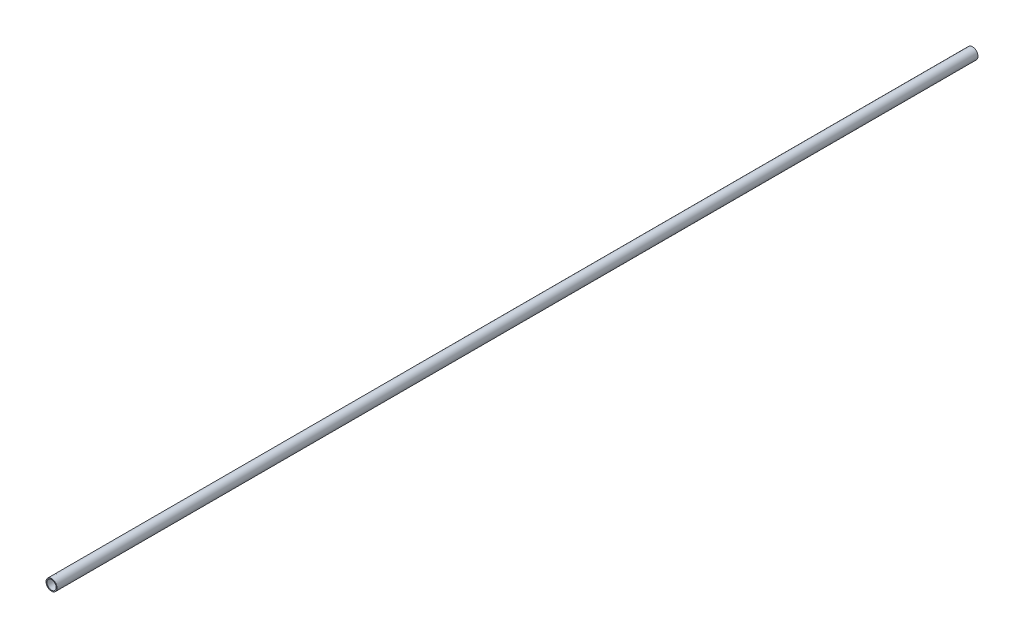
ISO-10303-21;
HEADER;
FILE_DESCRIPTION(('STEP AP214'),'2;1');
FILE_NAME('part.step','',(''),(''),'','','');
FILE_SCHEMA(('AUTOMOTIVE_DESIGN { 1 0 10303 214 1 1 1 1 }'));
ENDSEC;
DATA;
#1=APPLICATION_CONTEXT('core data for automotive mechanical design processes');
#2=APPLICATION_PROTOCOL_DEFINITION('international standard','automotive_design',2000,#1);
#3=PRODUCT_CONTEXT('',#1,'mechanical');
#4=PRODUCT('Part','Part','',(#3));
#5=PRODUCT_RELATED_PRODUCT_CATEGORY('part','',(#4));
#6=PRODUCT_DEFINITION_FORMATION('','',#4);
#7=PRODUCT_DEFINITION_CONTEXT('part definition',#1,'design');
#8=PRODUCT_DEFINITION('design','',#6,#7);
#9=PRODUCT_DEFINITION_SHAPE('','',#8);
#10=(LENGTH_UNIT() NAMED_UNIT(*) SI_UNIT(.MILLI.,.METRE.));
#11=(NAMED_UNIT(*) PLANE_ANGLE_UNIT() SI_UNIT($,.RADIAN.));
#12=(NAMED_UNIT(*) SI_UNIT($,.STERADIAN.) SOLID_ANGLE_UNIT());
#13=UNCERTAINTY_MEASURE_WITH_UNIT(LENGTH_MEASURE(1.E-05),#10,'distance_accuracy_value','');
#14=(GEOMETRIC_REPRESENTATION_CONTEXT(3) GLOBAL_UNCERTAINTY_ASSIGNED_CONTEXT((#13)) GLOBAL_UNIT_ASSIGNED_CONTEXT((#10,
#11,#12)) REPRESENTATION_CONTEXT('',''));
#15=CARTESIAN_POINT('',(0.,0.,0.));
#16=DIRECTION('',(0.,0.,1.));
#17=DIRECTION('',(1.,0.,0.));
#18=AXIS2_PLACEMENT_3D('',#15,#16,#17);
#19=CARTESIAN_POINT('',(0.,0.,500.));
#20=DIRECTION('',(0.,0.,1.));
#21=DIRECTION('',(1.,0.,0.));
#22=AXIS2_PLACEMENT_3D('',#19,#20,#21);
#23=PLANE('',#22);
#24=CARTESIAN_POINT('',(0.,0.,500.));
#25=DIRECTION('',(0.,0.,1.));
#26=DIRECTION('',(1.,0.,0.));
#27=AXIS2_PLACEMENT_3D('',#24,#25,#26);
#28=CIRCLE('',#27,6.);
#29=CARTESIAN_POINT('',(6.,0.,500.));
#30=VERTEX_POINT('',#29);
#31=EDGE_CURVE('E10',#30,#30,#28,.T.);
#32=ORIENTED_EDGE('',*,*,#31,.T.);
#33=EDGE_LOOP('',(#32));
#34=FACE_BOUND('',#33,.T.);
#35=CARTESIAN_POINT('',(0.,0.,500.));
#36=DIRECTION('',(0.,0.,1.));
#37=DIRECTION('',(1.,0.,0.));
#38=AXIS2_PLACEMENT_3D('',#35,#36,#37);
#39=CIRCLE('',#38,5.);
#40=CARTESIAN_POINT('',(5.,0.,500.));
#41=VERTEX_POINT('',#40);
#42=EDGE_CURVE('E50',#41,#41,#39,.T.);
#43=ORIENTED_EDGE('',*,*,#42,.F.);
#44=EDGE_LOOP('',(#43));
#45=FACE_BOUND('',#44,.T.);
#46=ADVANCED_FACE('F37',(#34,#45),#23,.T.);
#47=CARTESIAN_POINT('',(0.,0.,-500.));
#48=DIRECTION('',(0.,0.,1.));
#49=DIRECTION('',(1.,0.,0.));
#50=AXIS2_PLACEMENT_3D('',#47,#48,#49);
#51=PLANE('',#50);
#52=CARTESIAN_POINT('',(0.,0.,-500.));
#53=DIRECTION('',(0.,0.,1.));
#54=DIRECTION('',(1.,0.,0.));
#55=AXIS2_PLACEMENT_3D('',#52,#53,#54);
#56=CIRCLE('',#55,6.);
#57=CARTESIAN_POINT('',(6.,0.,-500.));
#58=VERTEX_POINT('',#57);
#59=EDGE_CURVE('E41',#58,#58,#56,.T.);
#60=ORIENTED_EDGE('',*,*,#59,.F.);
#61=EDGE_LOOP('',(#60));
#62=FACE_BOUND('',#61,.T.);
#63=CARTESIAN_POINT('',(0.,0.,-500.));
#64=DIRECTION('',(0.,0.,1.));
#65=DIRECTION('',(1.,0.,0.));
#66=AXIS2_PLACEMENT_3D('',#63,#64,#65);
#67=CIRCLE('',#66,5.);
#68=CARTESIAN_POINT('',(5.,0.,-500.));
#69=VERTEX_POINT('',#68);
#70=EDGE_CURVE('E52',#69,#69,#67,.T.);
#71=ORIENTED_EDGE('',*,*,#70,.T.);
#72=EDGE_LOOP('',(#71));
#73=FACE_BOUND('',#72,.T.);
#74=ADVANCED_FACE('F64',(#62,#73),#51,.F.);
#75=CARTESIAN_POINT('',(0.,0.,500.));
#76=DIRECTION('',(0.,0.,-1.));
#77=DIRECTION('',(-1.,0.,0.));
#78=AXIS2_PLACEMENT_3D('',#75,#76,#77);
#79=CYLINDRICAL_SURFACE('',#78,6.);
#80=ORIENTED_EDGE('',*,*,#31,.F.);
#81=EDGE_LOOP('',(#80));
#82=FACE_BOUND('',#81,.T.);
#83=ORIENTED_EDGE('',*,*,#59,.T.);
#84=EDGE_LOOP('',(#83));
#85=FACE_BOUND('',#84,.T.);
#86=ADVANCED_FACE('F39',(#82,#85),#79,.T.);
#87=CARTESIAN_POINT('',(0.,0.,500.));
#88=DIRECTION('',(0.,0.,-1.));
#89=DIRECTION('',(-1.,0.,0.));
#90=AXIS2_PLACEMENT_3D('',#87,#88,#89);
#91=CYLINDRICAL_SURFACE('',#90,5.);
#92=ORIENTED_EDGE('',*,*,#42,.T.);
#93=EDGE_LOOP('',(#92));
#94=FACE_BOUND('',#93,.T.);
#95=ORIENTED_EDGE('',*,*,#70,.F.);
#96=EDGE_LOOP('',(#95));
#97=FACE_BOUND('',#96,.T.);
#98=ADVANCED_FACE('F60',(#94,#97),#91,.F.);
#99=CLOSED_SHELL('',(#46,#74,#86,#98));
#100=MANIFOLD_SOLID_BREP('B2',#99);
#101=ADVANCED_BREP_SHAPE_REPRESENTATION('',(#18,#100),#14);
#102=SHAPE_DEFINITION_REPRESENTATION(#9,#101);
ENDSEC;
END-ISO-10303-21;
